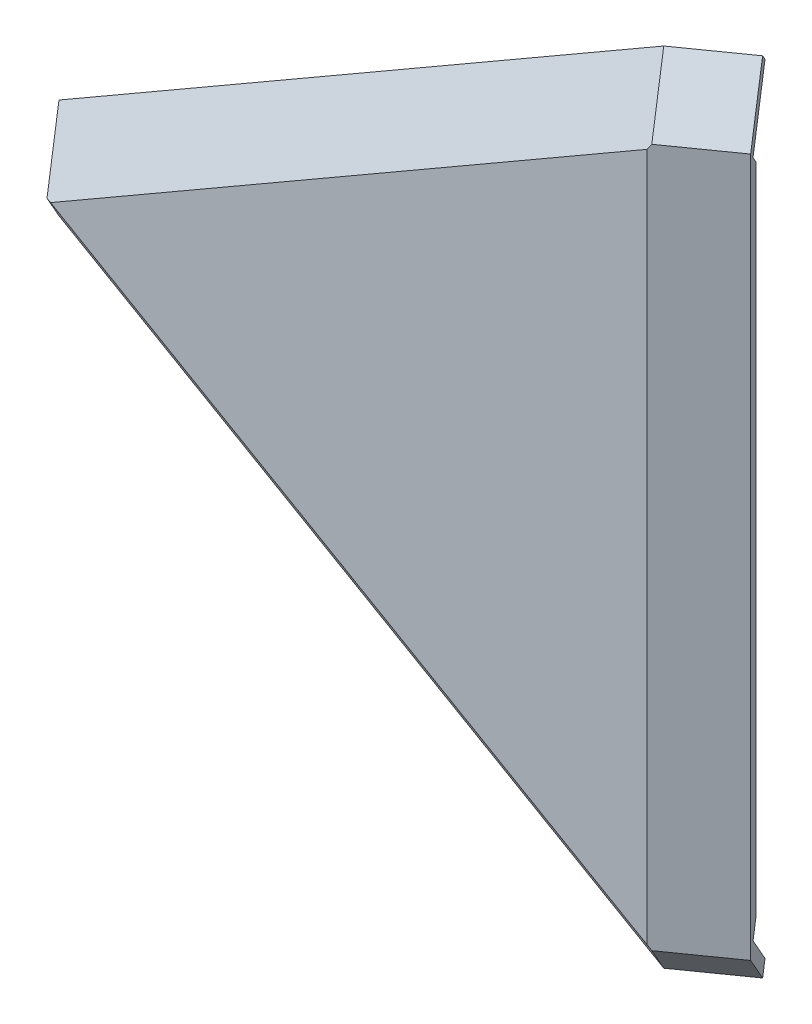
ISO-10303-21;
HEADER;
FILE_DESCRIPTION(('STEP AP214'),'2;1');
FILE_NAME('part.step','',(''),(''),'','','');
FILE_SCHEMA(('AUTOMOTIVE_DESIGN { 1 0 10303 214 1 1 1 1 }'));
ENDSEC;
DATA;
#1=APPLICATION_CONTEXT('core data for automotive mechanical design processes');
#2=APPLICATION_PROTOCOL_DEFINITION('international standard','automotive_design',2000,#1);
#3=PRODUCT_CONTEXT('',#1,'mechanical');
#4=PRODUCT('Part','Part','',(#3));
#5=PRODUCT_RELATED_PRODUCT_CATEGORY('part','',(#4));
#6=PRODUCT_DEFINITION_FORMATION('','',#4);
#7=PRODUCT_DEFINITION_CONTEXT('part definition',#1,'design');
#8=PRODUCT_DEFINITION('design','',#6,#7);
#9=PRODUCT_DEFINITION_SHAPE('','',#8);
#10=(LENGTH_UNIT() NAMED_UNIT(*) SI_UNIT(.MILLI.,.METRE.));
#11=(NAMED_UNIT(*) PLANE_ANGLE_UNIT() SI_UNIT($,.RADIAN.));
#12=(NAMED_UNIT(*) SI_UNIT($,.STERADIAN.) SOLID_ANGLE_UNIT());
#13=UNCERTAINTY_MEASURE_WITH_UNIT(LENGTH_MEASURE(1.E-05),#10,'distance_accuracy_value','');
#14=(GEOMETRIC_REPRESENTATION_CONTEXT(3) GLOBAL_UNCERTAINTY_ASSIGNED_CONTEXT((#13)) GLOBAL_UNIT_ASSIGNED_CONTEXT((#10,
#11,#12)) REPRESENTATION_CONTEXT('',''));
#15=CARTESIAN_POINT('',(0.,0.,0.));
#16=DIRECTION('',(0.,0.,1.));
#17=DIRECTION('',(1.,0.,0.));
#18=AXIS2_PLACEMENT_3D('',#15,#16,#17);
#19=CARTESIAN_POINT('',(107.819353421747,-2.5399538499415E-12,-76.2397959477388));
#20=DIRECTION('',(-0.816496580927468,0.,0.577350269189991));
#21=DIRECTION('',(0.577350269189991,0.,0.816496580927468));
#22=AXIS2_PLACEMENT_3D('',#19,#20,#21);
#23=PLANE('',#22);
#24=DIRECTION('',(0.408248290463936,-0.70710678118654,0.577350269189582));
#25=VECTOR('',#24,1.);
#26=CARTESIAN_POINT('',(153.663121969183,215.235385949433,-11.4069167177377));
#27=LINE('',#26,#25);
#28=CARTESIAN_POINT('',(153.663121969183,215.235385949433,-11.4069167177377));
#29=VERTEX_POINT('',#28);
#30=CARTESIAN_POINT('',(161.82808777846,201.093250325706,0.140088666051075));
#31=VERTEX_POINT('',#30);
#32=EDGE_CURVE('E137',#29,#31,#27,.T.);
#33=ORIENTED_EDGE('',*,*,#32,.T.);
#34=DIRECTION('',(0.408248290464021,0.707106781186744,0.577350269189274));
#35=VECTOR('',#34,1.);
#36=CARTESIAN_POINT('',(161.729030132728,200.921677450416,0.));
#37=LINE('',#36,#35);
#38=CARTESIAN_POINT('',(159.687788680409,197.386143544483,-2.88675134594536));
#39=VERTEX_POINT('',#38);
#40=EDGE_CURVE('E129',#39,#31,#37,.T.);
#41=ORIENTED_EDGE('',*,*,#40,.F.);
#42=DIRECTION('',(-0.408248290463866,0.707106781186549,-0.577350269189621));
#43=VECTOR('',#42,1.);
#44=CARTESIAN_POINT('',(151.522822871132,211.528279168213,-14.4337567297364));
#45=LINE('',#44,#43);
#46=CARTESIAN_POINT('',(151.522822871132,211.528279168213,-14.4337567297364));
#47=VERTEX_POINT('',#46);
#48=EDGE_CURVE('E132',#39,#47,#45,.T.);
#49=ORIENTED_EDGE('',*,*,#48,.T.);
#50=DIRECTION('',(-0.408248290464048,-0.707106781186266,-0.577350269189839));
#51=VECTOR('',#50,1.);
#52=CARTESIAN_POINT('',(153.564064323453,215.063813074144,-11.5470053837871));
#53=LINE('',#52,#51);
#54=EDGE_CURVE('E54',#29,#47,#53,.T.);
#55=ORIENTED_EDGE('',*,*,#54,.F.);
#56=EDGE_LOOP('',(#33,#41,#49,#55));
#57=FACE_BOUND('',#56,.T.);
#58=ADVANCED_FACE('F50',(#57),#23,.F.);
#59=CARTESIAN_POINT('',(178.058961751277,200.921677450415,-11.5470053837999));
#60=DIRECTION('',(0.408248290464223,-0.707106781186351,0.577350269189611));
#61=DIRECTION('',(0.,-0.632455532033772,-0.774596669241405));
#62=AXIS2_PLACEMENT_3D('',#59,#60,#61);
#63=PLANE('',#62);
#64=DIRECTION('',(0.816496580927581,0.,-0.57735026918983));
#65=VECTOR('',#64,1.);
#66=CARTESIAN_POINT('',(161.82808777846,201.093250325706,0.140088666051075));
#67=LINE('',#66,#65);
#68=CARTESIAN_POINT('',(178.158019397012,201.093250325707,-11.4069167177463));
#69=VERTEX_POINT('',#68);
#70=EDGE_CURVE('E713',#31,#69,#67,.T.);
#71=ORIENTED_EDGE('',*,*,#70,.T.);
#72=DIRECTION('',(0.408248290464021,0.707106781186744,0.577350269189274));
#73=VECTOR('',#72,1.);
#74=CARTESIAN_POINT('',(178.058961751277,200.921677450415,-11.5470053837999));
#75=LINE('',#74,#73);
#76=CARTESIAN_POINT('',(176.017720298958,197.386143544483,-14.4337567297453));
#77=VERTEX_POINT('',#76);
#78=EDGE_CURVE('E186',#77,#69,#75,.T.);
#79=ORIENTED_EDGE('',*,*,#78,.F.);
#80=DIRECTION('',(-0.816496580927468,0.,0.577350269189991));
#81=VECTOR('',#80,1.);
#82=CARTESIAN_POINT('',(176.017720298958,197.386143544483,-14.4337567297453));
#83=LINE('',#82,#81);
#84=EDGE_CURVE('E178',#77,#39,#83,.T.);
#85=ORIENTED_EDGE('',*,*,#84,.T.);
#86=ORIENTED_EDGE('',*,*,#40,.T.);
#87=EDGE_LOOP('',(#71,#79,#85,#86));
#88=FACE_BOUND('',#87,.T.);
#89=ADVANCED_FACE('F185',(#88),#63,.F.);
#90=CARTESIAN_POINT('',(29.8424114238205,51.6885728064443,42.203542969526));
#91=DIRECTION('',(0.408248290463677,0.707106781186408,0.577350269189928));
#92=DIRECTION('',(0.,-0.632455532033949,0.77459666924126));
#93=AXIS2_PLACEMENT_3D('',#90,#91,#92);
#94=PLANE('',#93);
#95=DIRECTION('',(-0.816496580927562,1.63757896132236E-13,0.577350269189858));
#96=VECTOR('',#95,1.);
#97=CARTESIAN_POINT('',(178.158019397001,9.83127365477043,-11.4069167177568));
#98=LINE('',#97,#96);
#99=CARTESIAN_POINT('',(178.158019397001,9.83127365477043,-11.4069167177568));
#100=VERTEX_POINT('',#99);
#101=CARTESIAN_POINT('',(161.828087778452,9.8312736547737,0.140088666038639));
#102=VERTEX_POINT('',#101);
#103=EDGE_CURVE('E493',#100,#102,#98,.T.);
#104=ORIENTED_EDGE('',*,*,#103,.T.);
#105=DIRECTION('',(0.408248290464025,-0.707106781186689,0.577350269189339));
#106=VECTOR('',#105,1.);
#107=CARTESIAN_POINT('',(161.729030132728,10.0028465300461,0.));
#108=LINE('',#107,#106);
#109=CARTESIAN_POINT('',(159.687788680408,13.538380435978,-2.88675134594544));
#110=VERTEX_POINT('',#109);
#111=EDGE_CURVE('E77',#110,#102,#108,.T.);
#112=ORIENTED_EDGE('',*,*,#111,.F.);
#113=DIRECTION('',(-0.816496580927468,0.,0.577350269189991));
#114=VECTOR('',#113,1.);
#115=CARTESIAN_POINT('',(176.017720298955,13.5383804359777,-14.4337567297433));
#116=LINE('',#115,#114);
#117=CARTESIAN_POINT('',(176.017720298955,13.5383804359777,-14.4337567297433));
#118=VERTEX_POINT('',#117);
#119=EDGE_CURVE('E180',#118,#110,#116,.T.);
#120=ORIENTED_EDGE('',*,*,#119,.F.);
#121=DIRECTION('',(-0.408248290464035,0.707106781186687,-0.577350269189334));
#122=VECTOR('',#121,1.);
#123=CARTESIAN_POINT('',(176.017720298955,13.5383804359777,-14.4337567297433));
#124=LINE('',#123,#122);
#125=EDGE_CURVE('E462',#100,#118,#124,.T.);
#126=ORIENTED_EDGE('',*,*,#125,.F.);
#127=EDGE_LOOP('',(#104,#112,#120,#126));
#128=FACE_BOUND('',#127,.T.);
#129=ADVANCED_FACE('F247',(#128),#94,.F.);
#130=CARTESIAN_POINT('',(153.564064323454,-4.13928909368204,-11.5470053837986));
#131=DIRECTION('',(-0.816496580927738,-4.41400388462299E-13,0.577350269189609));
#132=DIRECTION('',(0.577350269189609,0.,0.816496580927738));
#133=AXIS2_PLACEMENT_3D('',#130,#131,#132);
#134=PLANE('',#133);
#135=DIRECTION('',(-0.40824829046363,-0.707106781186473,-0.577350269189882));
#136=VECTOR('',#135,1.);
#137=CARTESIAN_POINT('',(161.828087778452,9.8312736547737,0.140088666038639));
#138=LINE('',#137,#136);
#139=CARTESIAN_POINT('',(153.663121969179,-4.31086196895558,-11.4069167177589));
#140=VERTEX_POINT('',#139);
#141=EDGE_CURVE('E497',#102,#140,#138,.T.);
#142=ORIENTED_EDGE('',*,*,#141,.T.);
#143=DIRECTION('',(0.408248290464025,-0.707106781186689,0.577350269189339));
#144=VECTOR('',#143,1.);
#145=CARTESIAN_POINT('',(153.564064323454,-4.13928909368204,-11.5470053837986));
#146=LINE('',#145,#144);
#147=CARTESIAN_POINT('',(151.522822871135,-0.603755187750129,-14.433756729744));
#148=VERTEX_POINT('',#147);
#149=EDGE_CURVE('E379',#148,#140,#146,.T.);
#150=ORIENTED_EDGE('',*,*,#149,.F.);
#151=DIRECTION('',(0.408248290463677,0.707106781186408,0.577350269189928));
#152=VECTOR('',#151,1.);
#153=CARTESIAN_POINT('',(151.522822871135,-0.603755187750129,-14.433756729744));
#154=LINE('',#153,#152);
#155=EDGE_CURVE('E142',#148,#110,#154,.T.);
#156=ORIENTED_EDGE('',*,*,#155,.T.);
#157=ORIENTED_EDGE('',*,*,#111,.T.);
#158=EDGE_LOOP('',(#142,#150,#156,#157));
#159=FACE_BOUND('',#158,.T.);
#160=ADVANCED_FACE('F255',(#159),#134,.F.);
#161=DIRECTION('',(0.816496580927866,2.1926904736363E-13,-0.577350269189428));
#162=VECTOR('',#161,1.);
#163=CARTESIAN_POINT('',(0.470955399494717,105.462261990218,-2.88675134595601));
#164=LINE('',#163,#162);
#165=CARTESIAN_POINT('',(-3.80964279655875,105.462261990225,0.140088666006006));
#166=VERTEX_POINT('',#165);
#167=CARTESIAN_POINT('',(0.470955399494717,105.462261990218,-2.88675134595601));
#168=VERTEX_POINT('',#167);
#169=EDGE_CURVE('E222',#166,#168,#164,.T.);
#170=ORIENTED_EDGE('',*,*,#169,.F.);
#171=DIRECTION('',(-0.408248290463558,0.707106781187085,-0.577350269189184));
#172=VECTOR('',#171,1.);
#173=CARTESIAN_POINT('',(-11.974608605828,119.604397613964,-11.406916717775));
#174=LINE('',#173,#172);
#175=CARTESIAN_POINT('',(-11.974608605828,119.604397613964,-11.406916717775));
#176=VERTEX_POINT('',#175);
#177=EDGE_CURVE('E512',#166,#176,#174,.T.);
#178=ORIENTED_EDGE('',*,*,#177,.T.);
#179=DIRECTION('',(0.816496580927807,-1.24900090270331E-13,-0.577350269189511));
#180=VECTOR('',#179,1.);
#181=CARTESIAN_POINT('',(-11.7764933144139,119.604397613963,-11.5470053837904));
#182=LINE('',#181,#180);
#183=CARTESIAN_POINT('',(-7.69401040977487,119.604397613962,-14.4337567297379));
#184=VERTEX_POINT('',#183);
#185=EDGE_CURVE('E214',#176,#184,#182,.T.);
#186=ORIENTED_EDGE('',*,*,#185,.T.);
#187=DIRECTION('',(0.408248290463855,-0.707106781186555,0.577350269189622));
#188=VECTOR('',#187,1.);
#189=CARTESIAN_POINT('',(0.470955399502234,105.462261990231,-2.8867513459455));
#190=LINE('',#189,#188);
#191=EDGE_CURVE('E205',#184,#168,#190,.T.);
#192=ORIENTED_EDGE('',*,*,#191,.T.);
#193=EDGE_LOOP('',(#170,#178,#186,#192));
#194=FACE_BOUND('',#193,.T.);
#195=ADVANCED_FACE('F237',(#194),#94,.F.);
#196=CARTESIAN_POINT('',(0.,0.,-2.88675134594544));
#197=DIRECTION('',(0.,0.,-1.));
#198=DIRECTION('',(-1.,0.,0.));
#199=AXIS2_PLACEMENT_3D('',#196,#197,#198);
#200=PLANE('',#199);
#201=DIRECTION('',(-0.866025403784436,-0.500000000000004,0.));
#202=VECTOR('',#201,1.);
#203=CARTESIAN_POINT('',(0.470955399502207,105.462261990231,-2.88675134594544));
#204=LINE('',#203,#202);
#205=EDGE_CURVE('E147',#39,#168,#204,.T.);
#206=ORIENTED_EDGE('',*,*,#205,.F.);
#207=DIRECTION('',(0.,1.,0.));
#208=VECTOR('',#207,1.);
#209=CARTESIAN_POINT('',(159.687788680409,197.386143544483,-2.88675134594544));
#210=LINE('',#209,#208);
#211=EDGE_CURVE('E151',#110,#39,#210,.T.);
#212=ORIENTED_EDGE('',*,*,#211,.F.);
#213=DIRECTION('',(0.866025403784434,-0.500000000000009,0.));
#214=VECTOR('',#213,1.);
#215=CARTESIAN_POINT('',(159.687788680408,13.538380435978,-2.88675134594544));
#216=LINE('',#215,#214);
#217=EDGE_CURVE('E156',#168,#110,#216,.T.);
#218=ORIENTED_EDGE('',*,*,#217,.F.);
#219=EDGE_LOOP('',(#206,#212,#218));
#220=FACE_BOUND('',#219,.T.);
#221=ADVANCED_FACE('F149',(#220),#200,.T.);
#222=CARTESIAN_POINT('',(0.,0.,3.));
#223=DIRECTION('',(0.,0.,-1.));
#224=DIRECTION('',(-1.,0.,0.));
#225=AXIS2_PLACEMENT_3D('',#222,#223,#224);
#226=PLANE('',#225);
#227=DIRECTION('',(-0.866025403784435,-0.500000000000006,0.));
#228=VECTOR('',#227,1.);
#229=CARTESIAN_POINT('',(-47.0461367561351,81.4862991614583,3.));
#230=LINE('',#229,#228);
#231=CARTESIAN_POINT('',(162.682541868316,202.573208222072,3.));
#232=VERTEX_POINT('',#231);
#233=CARTESIAN_POINT('',(-5.51855097631453,105.462261990233,3.));
#234=VERTEX_POINT('',#233);
#235=EDGE_CURVE('E171',#232,#234,#230,.T.);
#236=ORIENTED_EDGE('',*,*,#235,.T.);
#237=DIRECTION('',(0.866025403784433,-0.500000000000009,0.));
#238=VECTOR('',#237,1.);
#239=CARTESIAN_POINT('',(44.2868612679779,76.7070938238901,3.));
#240=LINE('',#239,#238);
#241=CARTESIAN_POINT('',(162.682541868316,8.35131575839451,3.));
#242=VERTEX_POINT('',#241);
#243=EDGE_CURVE('E163',#234,#242,#240,.T.);
#244=ORIENTED_EDGE('',*,*,#243,.T.);
#245=DIRECTION('',(0.,1.,0.));
#246=VECTOR('',#245,1.);
#247=CARTESIAN_POINT('',(162.682541868316,-2.90853924134329E-13,3.));
#248=LINE('',#247,#246);
#249=EDGE_CURVE('E360',#242,#232,#248,.T.);
#250=ORIENTED_EDGE('',*,*,#249,.T.);
#251=EDGE_LOOP('',(#236,#244,#250));
#252=FACE_BOUND('',#251,.T.);
#253=ADVANCED_FACE('F263',(#252),#226,.F.);
#254=CARTESIAN_POINT('',(-14.5025062366206,25.119077638911,41.0192820164584));
#255=DIRECTION('',(0.288675134594814,-0.499999999999995,-0.816496580927729));
#256=DIRECTION('',(0.,0.852802865422445,-0.522232967867088));
#257=AXIS2_PLACEMENT_3D('',#254,#255,#256);
#258=PLANE('',#257);
#259=ORIENTED_EDGE('',*,*,#205,.T.);
#260=ORIENTED_EDGE('',*,*,#191,.F.);
#261=DIRECTION('',(-0.866025403784441,-0.499999999999995,0.));
#262=VECTOR('',#261,1.);
#263=CARTESIAN_POINT('',(-7.69401040977487,119.604397613962,-14.4337567297379));
#264=LINE('',#263,#262);
#265=EDGE_CURVE('E169',#47,#184,#264,.T.);
#266=ORIENTED_EDGE('',*,*,#265,.F.);
#267=ORIENTED_EDGE('',*,*,#48,.F.);
#268=EDGE_LOOP('',(#259,#260,#266,#267));
#269=FACE_BOUND('',#268,.T.);
#270=ADVANCED_FACE('F168',(#269),#258,.T.);
#271=CARTESIAN_POINT('',(-16.3891523665647,28.3868445918773,46.3555231051897));
#272=DIRECTION('',(0.288675134594815,-0.499999999999995,-0.816496580927729));
#273=DIRECTION('',(0.,0.852802865422445,-0.522232967867089));
#274=AXIS2_PLACEMENT_3D('',#271,#272,#273);
#275=PLANE('',#274);
#276=ORIENTED_EDGE('',*,*,#235,.F.);
#277=DIRECTION('',(0.47140452079078,0.816496580927816,-0.33333333333347));
#278=VECTOR('',#277,1.);
#279=CARTESIAN_POINT('',(49.0318062200292,5.72435976153241,83.3632058638193));
#280=LINE('',#279,#278);
#281=CARTESIAN_POINT('',(163.461080940316,203.921677450452,2.44948974280926));
#282=VERTEX_POINT('',#281);
#283=EDGE_CURVE('E13',#232,#282,#280,.T.);
#284=ORIENTED_EDGE('',*,*,#283,.T.);
#285=DIRECTION('',(-0.408248290464231,0.707106781186338,-0.577350269189622));
#286=VECTOR('',#285,1.);
#287=CARTESIAN_POINT('',(194.507334865846,150.147988266754,46.355523105131));
#288=LINE('',#287,#286);
#289=CARTESIAN_POINT('',(155.296115131039,218.063813074179,-9.09751564097952));
#290=VERTEX_POINT('',#289);
#291=EDGE_CURVE('E386',#282,#290,#288,.T.);
#292=ORIENTED_EDGE('',*,*,#291,.T.);
#293=DIRECTION('',(-0.866025403784606,-0.499999999999709,-2.42284983216453E-13));
#294=VECTOR('',#293,1.);
#295=CARTESIAN_POINT('',(-55.6003721013752,96.3026693993961,-9.09751564101898));
#296=LINE('',#295,#294);
#297=CARTESIAN_POINT('',(-15.2405949295391,119.604397613963,-9.09751564101679));
#298=VERTEX_POINT('',#297);
#299=EDGE_CURVE('E383',#290,#298,#296,.T.);
#300=ORIENTED_EDGE('',*,*,#299,.T.);
#301=DIRECTION('',(0.408248290463627,-0.707106781186687,0.577350269189622));
#302=VECTOR('',#301,1.);
#303=CARTESIAN_POINT('',(23.970624805246,51.6885728064436,46.3555231051973));
#304=LINE('',#303,#302);
#305=CARTESIAN_POINT('',(-7.07562912026987,105.462261990225,2.4494897427642));
#306=VERTEX_POINT('',#305);
#307=EDGE_CURVE('E371',#298,#306,#304,.T.);
#308=ORIENTED_EDGE('',*,*,#307,.T.);
#309=DIRECTION('',(-0.942809041582021,2.17903721745327E-13,-0.333333333333453));
#310=VECTOR('',#309,1.);
#311=CARTESIAN_POINT('',(-15.6528491225571,105.462261990236,-0.583015470888635));
#312=LINE('',#311,#310);
#313=EDGE_CURVE('E60',#234,#306,#312,.T.);
#314=ORIENTED_EDGE('',*,*,#313,.F.);
#315=EDGE_LOOP('',(#276,#284,#292,#300,#308,#314));
#316=FACE_BOUND('',#315,.T.);
#317=ADVANCED_FACE('F52',(#316),#275,.F.);
#318=CARTESIAN_POINT('',(-39.2112197348178,67.9158248075314,-55.4530387462021));
#319=DIRECTION('',(0.408248290463547,-0.707106781186829,0.577350269189505));
#320=DIRECTION('',(0.,-0.632455532033445,-0.774596669241672));
#321=AXIS2_PLACEMENT_3D('',#318,#319,#320);
#322=PLANE('',#321);
#323=ORIENTED_EDGE('',*,*,#299,.F.);
#324=DIRECTION('',(-0.816496580927639,0.,0.577350269189749));
#325=VECTOR('',#324,1.);
#326=CARTESIAN_POINT('',(171.626046749607,218.063813074178,-20.6445210247855));
#327=LINE('',#326,#325);
#328=CARTESIAN_POINT('',(171.626046749607,218.063813074178,-20.6445210247855));
#329=VERTEX_POINT('',#328);
#330=EDGE_CURVE('E395',#329,#290,#327,.T.);
#331=ORIENTED_EDGE('',*,*,#330,.F.);
#332=DIRECTION('',(0.408248290463962,0.707106781186556,0.577350269189546));
#333=VECTOR('',#332,1.);
#334=CARTESIAN_POINT('',(169.993053587751,215.235385949432,-22.9539221015437));
#335=LINE('',#334,#333);
#336=CARTESIAN_POINT('',(169.993053587751,215.235385949432,-22.9539221015437));
#337=VERTEX_POINT('',#336);
#338=EDGE_CURVE('E510',#337,#329,#335,.T.);
#339=ORIENTED_EDGE('',*,*,#338,.F.);
#340=DIRECTION('',(-0.816496580927639,0.,0.577350269189749));
#341=VECTOR('',#340,1.);
#342=CARTESIAN_POINT('',(169.993053587751,215.235385949432,-22.9539221015437));
#343=LINE('',#342,#341);
#344=EDGE_CURVE('E523',#337,#29,#343,.T.);
#345=ORIENTED_EDGE('',*,*,#344,.T.);
#346=ORIENTED_EDGE('',*,*,#54,.T.);
#347=ORIENTED_EDGE('',*,*,#265,.T.);
#348=ORIENTED_EDGE('',*,*,#185,.F.);
#349=DIRECTION('',(-0.408248290463645,-0.70710678118673,-0.577350269189557));
#350=VECTOR('',#349,1.);
#351=CARTESIAN_POINT('',(-20.1395744151097,105.462261990214,-22.9539221015786));
#352=LINE('',#351,#350);
#353=CARTESIAN_POINT('',(-20.1395744151097,105.462261990214,-22.9539221015786));
#354=VERTEX_POINT('',#353);
#355=EDGE_CURVE('E514',#176,#354,#352,.T.);
#356=ORIENTED_EDGE('',*,*,#355,.T.);
#357=DIRECTION('',(-0.81649658092778,-1.02362562870439E-13,0.577350269189549));
#358=VECTOR('',#357,1.);
#359=CARTESIAN_POINT('',(-20.1395744151097,105.462261990214,-22.9539221015786));
#360=LINE('',#359,#358);
#361=CARTESIAN_POINT('',(-23.4055607388209,105.462261990213,-20.6445210248204));
#362=VERTEX_POINT('',#361);
#363=EDGE_CURVE('E402',#354,#362,#360,.T.);
#364=ORIENTED_EDGE('',*,*,#363,.T.);
#365=DIRECTION('',(-0.408248290463645,-0.70710678118673,-0.577350269189557));
#366=VECTOR('',#365,1.);
#367=CARTESIAN_POINT('',(-23.4055607388209,105.462261990213,-20.6445210248204));
#368=LINE('',#367,#366);
#369=EDGE_CURVE('E398',#298,#362,#368,.T.);
#370=ORIENTED_EDGE('',*,*,#369,.F.);
#371=EDGE_LOOP('',(#323,#331,#339,#345,#346,#347,#348,#356,#364,#370));
#372=FACE_BOUND('',#371,.T.);
#373=ADVANCED_FACE('F231',(#372),#322,.F.);
#374=CARTESIAN_POINT('',(179.791012558844,10.0028465300458,-9.09751564101553));
#375=DIRECTION('',(-0.577350269189991,0.,-0.816496580927468));
#376=DIRECTION('',(-0.816496580927468,0.,0.577350269189991));
#377=AXIS2_PLACEMENT_3D('',#374,#375,#376);
#378=PLANE('',#377);
#379=ORIENTED_EDGE('',*,*,#249,.F.);
#380=DIRECTION('',(0.471404520790943,-0.816496580927673,-0.333333333333588));
#381=VECTOR('',#380,1.);
#382=CARTESIAN_POINT('',(167.749690941435,-0.425243885774727,-0.583015470889195));
#383=LINE('',#382,#381);
#384=CARTESIAN_POINT('',(163.461080940307,7.00284653002721,2.4494897427967));
#385=VERTEX_POINT('',#384);
#386=EDGE_CURVE('E366',#242,#385,#383,.T.);
#387=ORIENTED_EDGE('',*,*,#386,.T.);
#388=DIRECTION('',(-0.816496580927468,-9.08875775284897E-13,0.577350269189991));
#389=VECTOR('',#388,1.);
#390=CARTESIAN_POINT('',(55.6417275185422,7.00284652992497,78.689285690527));
#391=LINE('',#390,#389);
#392=CARTESIAN_POINT('',(179.791012558856,7.00284653002393,-9.0975156409987));
#393=VERTEX_POINT('',#392);
#394=EDGE_CURVE('E188',#393,#385,#391,.T.);
#395=ORIENTED_EDGE('',*,*,#394,.F.);
#396=DIRECTION('',(0.,-1.,0.));
#397=VECTOR('',#396,1.);
#398=CARTESIAN_POINT('',(179.791012558844,-3.02113222563973E-12,-9.09751564101539));
#399=LINE('',#398,#397);
#400=CARTESIAN_POINT('',(179.791012558847,203.921677450417,-9.09751564101752));
#401=VERTEX_POINT('',#400);
#402=EDGE_CURVE('E141',#401,#393,#399,.T.);
#403=ORIENTED_EDGE('',*,*,#402,.F.);
#404=DIRECTION('',(-0.816496580927468,0.,0.577350269189991));
#405=VECTOR('',#404,1.);
#406=CARTESIAN_POINT('',(179.791012558847,203.921677450417,-9.09751564101752));
#407=LINE('',#406,#405);
#408=EDGE_CURVE('E104',#401,#282,#407,.T.);
#409=ORIENTED_EDGE('',*,*,#408,.T.);
#410=ORIENTED_EDGE('',*,*,#283,.F.);
#411=EDGE_LOOP('',(#379,#387,#395,#403,#409,#410));
#412=FACE_BOUND('',#411,.T.);
#413=ADVANCED_FACE('F264',(#412),#378,.F.);
#414=CARTESIAN_POINT('',(176.017720298958,197.386143544483,-14.4337567297453));
#415=DIRECTION('',(0.577350269189991,0.,0.816496580927468));
#416=DIRECTION('',(0.816496580927468,0.,-0.577350269189991));
#417=AXIS2_PLACEMENT_3D('',#414,#415,#416);
#418=PLANE('',#417);
#419=ORIENTED_EDGE('',*,*,#211,.T.);
#420=ORIENTED_EDGE('',*,*,#84,.F.);
#421=DIRECTION('',(0.,1.,0.));
#422=VECTOR('',#421,1.);
#423=CARTESIAN_POINT('',(176.017720298958,197.386143544483,-14.4337567297453));
#424=LINE('',#423,#422);
#425=EDGE_CURVE('E115',#118,#77,#424,.T.);
#426=ORIENTED_EDGE('',*,*,#425,.F.);
#427=ORIENTED_EDGE('',*,*,#119,.T.);
#428=EDGE_LOOP('',(#419,#420,#426,#427));
#429=FACE_BOUND('',#428,.T.);
#430=ADVANCED_FACE('F177',(#429),#418,.F.);
#431=CARTESIAN_POINT('',(124.149285040296,-2.92165249899836E-12,-87.7868013315389));
#432=DIRECTION('',(-0.816496580927466,0.,0.577350269189994));
#433=DIRECTION('',(0.577350269189994,0.,0.816496580927466));
#434=AXIS2_PLACEMENT_3D('',#431,#432,#433);
#435=PLANE('',#434);
#436=ORIENTED_EDGE('',*,*,#402,.T.);
#437=DIRECTION('',(0.408248290463695,0.707106781186473,0.577350269189836));
#438=VECTOR('',#437,1.);
#439=CARTESIAN_POINT('',(171.626046749584,-7.13928909370185,-20.6445210247924));
#440=LINE('',#439,#438);
#441=CARTESIAN_POINT('',(171.626046749584,-7.13928909370185,-20.6445210247924));
#442=VERTEX_POINT('',#441);
#443=EDGE_CURVE('E499',#442,#393,#440,.T.);
#444=ORIENTED_EDGE('',*,*,#443,.F.);
#445=DIRECTION('',(0.40824829046389,-0.707106781186623,0.577350269189515));
#446=VECTOR('',#445,1.);
#447=CARTESIAN_POINT('',(169.993053587729,-4.31086196895535,-22.9539221015505));
#448=LINE('',#447,#446);
#449=CARTESIAN_POINT('',(169.993053587729,-4.31086196895535,-22.9539221015505));
#450=VERTEX_POINT('',#449);
#451=EDGE_CURVE('E409',#450,#442,#448,.T.);
#452=ORIENTED_EDGE('',*,*,#451,.F.);
#453=DIRECTION('',(0.408248290463695,0.707106781186473,0.577350269189836));
#454=VECTOR('',#453,1.);
#455=CARTESIAN_POINT('',(169.993053587729,-4.31086196895535,-22.9539221015505));
#456=LINE('',#455,#454);
#457=EDGE_CURVE('E495',#450,#100,#456,.T.);
#458=ORIENTED_EDGE('',*,*,#457,.T.);
#459=ORIENTED_EDGE('',*,*,#125,.T.);
#460=ORIENTED_EDGE('',*,*,#425,.T.);
#461=ORIENTED_EDGE('',*,*,#78,.T.);
#462=DIRECTION('',(-0.408248290463212,0.70710678118654,-0.577350269190096));
#463=VECTOR('',#462,1.);
#464=CARTESIAN_POINT('',(178.158019397012,201.093250325707,-11.4069167177463));
#465=LINE('',#464,#463);
#466=EDGE_CURVE('E471',#69,#337,#465,.T.);
#467=ORIENTED_EDGE('',*,*,#466,.T.);
#468=ORIENTED_EDGE('',*,*,#338,.T.);
#469=DIRECTION('',(-0.408248290463212,0.70710678118654,-0.577350269190096));
#470=VECTOR('',#469,1.);
#471=CARTESIAN_POINT('',(179.791012558868,203.921677450453,-9.09751564098812));
#472=LINE('',#471,#470);
#473=EDGE_CURVE('E519',#401,#329,#472,.T.);
#474=ORIENTED_EDGE('',*,*,#473,.F.);
#475=EDGE_LOOP('',(#436,#444,#452,#458,#459,#460,#461,#467,#468,#474));
#476=FACE_BOUND('',#475,.T.);
#477=ADVANCED_FACE('F323',(#476),#435,.F.);
#478=CARTESIAN_POINT('',(151.522822871135,-0.603755187750129,-14.433756729744));
#479=DIRECTION('',(-0.288675134594969,-0.500000000000259,0.816496580927512));
#480=DIRECTION('',(0.,-0.85280286542226,-0.52223296786739));
#481=AXIS2_PLACEMENT_3D('',#478,#479,#480);
#482=PLANE('',#481);
#483=ORIENTED_EDGE('',*,*,#217,.T.);
#484=ORIENTED_EDGE('',*,*,#155,.F.);
#485=DIRECTION('',(0.866025403784474,-0.499999999999938,0.));
#486=VECTOR('',#485,1.);
#487=CARTESIAN_POINT('',(151.522822871135,-0.603755187750129,-14.433756729744));
#488=LINE('',#487,#486);
#489=CARTESIAN_POINT('',(-7.69401040977882,91.32012636649,-14.4337567297546));
#490=VERTEX_POINT('',#489);
#491=EDGE_CURVE('E225',#490,#148,#488,.T.);
#492=ORIENTED_EDGE('',*,*,#491,.F.);
#493=DIRECTION('',(0.408248290463677,0.707106781186408,0.577350269189928));
#494=VECTOR('',#493,1.);
#495=CARTESIAN_POINT('',(-7.69401040977882,91.32012636649,-14.4337567297546));
#496=LINE('',#495,#494);
#497=EDGE_CURVE('E219',#490,#168,#496,.T.);
#498=ORIENTED_EDGE('',*,*,#497,.T.);
#499=EDGE_LOOP('',(#483,#484,#492,#498));
#500=FACE_BOUND('',#499,.T.);
#501=ADVANCED_FACE('F312',(#500),#482,.F.);
#502=CARTESIAN_POINT('',(-12.6425187182001,89.8201263664881,-9.09751564102702));
#503=DIRECTION('',(0.288675134594969,0.500000000000259,-0.816496580927512));
#504=DIRECTION('',(0.,0.85280286542226,0.52223296786739));
#505=AXIS2_PLACEMENT_3D('',#502,#503,#504);
#506=PLANE('',#505);
#507=ORIENTED_EDGE('',*,*,#243,.F.);
#508=ORIENTED_EDGE('',*,*,#313,.T.);
#509=DIRECTION('',(0.408248290463677,0.707106781186408,0.577350269189928));
#510=VECTOR('',#509,1.);
#511=CARTESIAN_POINT('',(-15.2405949295535,91.320126366488,-9.09751564102719));
#512=LINE('',#511,#510);
#513=CARTESIAN_POINT('',(-15.2405949295465,91.320126366488,-9.09751564103218));
#514=VERTEX_POINT('',#513);
#515=EDGE_CURVE('E374',#514,#306,#512,.T.);
#516=ORIENTED_EDGE('',*,*,#515,.F.);
#517=DIRECTION('',(-0.866025403784474,0.499999999999938,0.));
#518=VECTOR('',#517,1.);
#519=CARTESIAN_POINT('',(35.7326259227016,61.8907235859811,-9.0975156410238));
#520=LINE('',#519,#518);
#521=CARTESIAN_POINT('',(155.296115131024,-7.13928909368356,-9.09751564101586));
#522=VERTEX_POINT('',#521);
#523=EDGE_CURVE('E375',#522,#514,#520,.T.);
#524=ORIENTED_EDGE('',*,*,#523,.F.);
#525=DIRECTION('',(0.408248290463677,0.707106781186408,0.577350269189928));
#526=VECTOR('',#525,1.);
#527=CARTESIAN_POINT('',(155.296115131024,-7.13928909368358,-9.09751564101586));
#528=LINE('',#527,#526);
#529=EDGE_CURVE('E301',#522,#385,#528,.T.);
#530=ORIENTED_EDGE('',*,*,#529,.T.);
#531=ORIENTED_EDGE('',*,*,#386,.F.);
#532=EDGE_LOOP('',(#507,#508,#516,#524,#530,#531));
#533=FACE_BOUND('',#532,.T.);
#534=ADVANCED_FACE('F322',(#533),#506,.F.);
#535=CARTESIAN_POINT('',(-7.69401040977882,91.32012636649,-14.4337567297546));
#536=DIRECTION('',(0.408248290463769,-0.707106781186687,0.577350269189521));
#537=DIRECTION('',(0.,-0.632455532033532,-0.774596669241601));
#538=AXIS2_PLACEMENT_3D('',#535,#536,#537);
#539=PLANE('',#538);
#540=DIRECTION('',(0.816496580927866,2.1926904736363E-13,-0.577350269189428));
#541=VECTOR('',#540,1.);
#542=CARTESIAN_POINT('',(-7.69401040977882,91.32012636649,-14.4337567297546));
#543=LINE('',#542,#541);
#544=CARTESIAN_POINT('',(-11.9746086058344,91.3201263664889,-11.4069167177903));
#545=VERTEX_POINT('',#544);
#546=EDGE_CURVE('E378',#545,#490,#543,.T.);
#547=ORIENTED_EDGE('',*,*,#546,.F.);
#548=DIRECTION('',(0.408248290463703,0.707106781186628,0.57735026918964));
#549=VECTOR('',#548,1.);
#550=CARTESIAN_POINT('',(-3.80964279655875,105.462261990225,0.140088666006006));
#551=LINE('',#550,#549);
#552=EDGE_CURVE('E68',#545,#166,#551,.T.);
#553=ORIENTED_EDGE('',*,*,#552,.T.);
#554=ORIENTED_EDGE('',*,*,#169,.T.);
#555=ORIENTED_EDGE('',*,*,#497,.F.);
#556=EDGE_LOOP('',(#547,#553,#554,#555));
#557=FACE_BOUND('',#556,.T.);
#558=ADVANCED_FACE('F456',(#557),#539,.F.);
#559=CARTESIAN_POINT('',(21.677445614547,37.5464371827162,30.6565375857275));
#560=DIRECTION('',(0.408248290463677,0.707106781186408,0.577350269189928));
#561=DIRECTION('',(0.,-0.632455532033949,0.77459666924126));
#562=AXIS2_PLACEMENT_3D('',#559,#560,#561);
#563=PLANE('',#562);
#564=ORIENTED_EDGE('',*,*,#491,.T.);
#565=ORIENTED_EDGE('',*,*,#149,.T.);
#566=DIRECTION('',(0.816496580927663,0.,-0.577350269189715));
#567=VECTOR('',#566,1.);
#568=CARTESIAN_POINT('',(153.663121969179,-4.31086196895558,-11.4069167177589));
#569=LINE('',#568,#567);
#570=EDGE_CURVE('E501',#140,#450,#569,.T.);
#571=ORIENTED_EDGE('',*,*,#570,.T.);
#572=ORIENTED_EDGE('',*,*,#451,.T.);
#573=DIRECTION('',(0.816496580927663,0.,-0.577350269189715));
#574=VECTOR('',#573,1.);
#575=CARTESIAN_POINT('',(155.296115131035,-7.13928909370207,-9.0975156410008));
#576=LINE('',#575,#574);
#577=EDGE_CURVE('E507',#522,#442,#576,.T.);
#578=ORIENTED_EDGE('',*,*,#577,.F.);
#579=ORIENTED_EDGE('',*,*,#523,.T.);
#580=DIRECTION('',(0.408248290463873,-0.707106781186538,0.57735026918963));
#581=VECTOR('',#580,1.);
#582=CARTESIAN_POINT('',(-15.2405949295465,91.320126366488,-9.09751564103218));
#583=LINE('',#582,#581);
#584=EDGE_CURVE('E408',#362,#514,#583,.T.);
#585=ORIENTED_EDGE('',*,*,#584,.F.);
#586=ORIENTED_EDGE('',*,*,#363,.F.);
#587=DIRECTION('',(0.408248290463873,-0.707106781186538,0.57735026918963));
#588=VECTOR('',#587,1.);
#589=CARTESIAN_POINT('',(-11.9746086058353,91.3201263664884,-11.4069167177904));
#590=LINE('',#589,#588);
#591=EDGE_CURVE('E453',#354,#545,#590,.T.);
#592=ORIENTED_EDGE('',*,*,#591,.T.);
#593=ORIENTED_EDGE('',*,*,#546,.T.);
#594=EDGE_LOOP('',(#564,#565,#571,#572,#578,#579,#585,#586,#592,#593));
#595=FACE_BOUND('',#594,.T.);
#596=ADVANCED_FACE('F450',(#595),#563,.F.);
#597=CARTESIAN_POINT('',(-2.60580029483083,-3.27282841351587E-13,1.84257905889242));
#598=DIRECTION('',(0.81649658092778,1.02445829597286E-13,-0.577350269189549));
#599=DIRECTION('',(-0.577350269189549,0.,-0.81649658092778));
#600=AXIS2_PLACEMENT_3D('',#597,#598,#599);
#601=PLANE('',#600);
#602=ORIENTED_EDGE('',*,*,#177,.F.);
#603=ORIENTED_EDGE('',*,*,#552,.F.);
#604=ORIENTED_EDGE('',*,*,#591,.F.);
#605=ORIENTED_EDGE('',*,*,#355,.F.);
#606=EDGE_LOOP('',(#602,#603,#604,#605));
#607=FACE_BOUND('',#606,.T.);
#608=ADVANCED_FACE('F583',(#607),#601,.T.);
#609=CARTESIAN_POINT('',(-5.87178661854195,-7.36733092833344E-13,4.15198013565061));
#610=DIRECTION('',(0.81649658092778,1.02445829597286E-13,-0.577350269189549));
#611=DIRECTION('',(-0.577350269189549,0.,-0.81649658092778));
#612=AXIS2_PLACEMENT_3D('',#609,#610,#611);
#613=PLANE('',#612);
#614=ORIENTED_EDGE('',*,*,#307,.F.);
#615=ORIENTED_EDGE('',*,*,#369,.T.);
#616=ORIENTED_EDGE('',*,*,#584,.T.);
#617=ORIENTED_EDGE('',*,*,#515,.T.);
#618=EDGE_LOOP('',(#614,#615,#616,#617));
#619=FACE_BOUND('',#618,.T.);
#620=ADVANCED_FACE('F411',(#619),#613,.F.);
#621=CARTESIAN_POINT('',(24.1663229327892,-41.8572991517095,34.1763416442297));
#622=DIRECTION('',(0.40824829046389,-0.707106781186623,0.577350269189515));
#623=DIRECTION('',(0.,-0.632455532033563,-0.774596669241576));
#624=AXIS2_PLACEMENT_3D('',#621,#622,#623);
#625=PLANE('',#624);
#626=ORIENTED_EDGE('',*,*,#103,.F.);
#627=ORIENTED_EDGE('',*,*,#457,.F.);
#628=ORIENTED_EDGE('',*,*,#570,.F.);
#629=ORIENTED_EDGE('',*,*,#141,.F.);
#630=EDGE_LOOP('',(#626,#627,#628,#629));
#631=FACE_BOUND('',#630,.T.);
#632=ADVANCED_FACE('F494',(#631),#625,.F.);
#633=CARTESIAN_POINT('',(25.7993160946448,-44.685726276456,36.4857427209877));
#634=DIRECTION('',(0.40824829046389,-0.707106781186623,0.577350269189515));
#635=DIRECTION('',(0.,-0.632455532033563,-0.774596669241576));
#636=AXIS2_PLACEMENT_3D('',#633,#634,#635);
#637=PLANE('',#636);
#638=ORIENTED_EDGE('',*,*,#394,.T.);
#639=ORIENTED_EDGE('',*,*,#529,.F.);
#640=ORIENTED_EDGE('',*,*,#577,.T.);
#641=ORIENTED_EDGE('',*,*,#443,.T.);
#642=EDGE_LOOP('',(#638,#639,#640,#641));
#643=FACE_BOUND('',#642,.T.);
#644=ADVANCED_FACE('F518',(#643),#637,.T.);
#645=CARTESIAN_POINT('',(85.05498828223,147.319561141963,120.285917976169));
#646=DIRECTION('',(0.408248290463963,0.707106781186555,0.577350269189547));
#647=DIRECTION('',(0.,-0.63245553203362,0.774596669241529));
#648=AXIS2_PLACEMENT_3D('',#645,#646,#647);
#649=PLANE('',#648);
#650=ORIENTED_EDGE('',*,*,#32,.F.);
#651=ORIENTED_EDGE('',*,*,#344,.F.);
#652=ORIENTED_EDGE('',*,*,#466,.F.);
#653=ORIENTED_EDGE('',*,*,#70,.F.);
#654=EDGE_LOOP('',(#650,#651,#652,#653));
#655=FACE_BOUND('',#654,.T.);
#656=ADVANCED_FACE('F608',(#655),#649,.F.);
#657=CARTESIAN_POINT('',(86.6879814440859,150.14798826671,122.595319052927));
#658=DIRECTION('',(0.408248290463963,0.707106781186555,0.577350269189547));
#659=DIRECTION('',(0.,-0.63245553203362,0.774596669241529));
#660=AXIS2_PLACEMENT_3D('',#657,#658,#659);
#661=PLANE('',#660);
#662=ORIENTED_EDGE('',*,*,#291,.F.);
#663=ORIENTED_EDGE('',*,*,#408,.F.);
#664=ORIENTED_EDGE('',*,*,#473,.T.);
#665=ORIENTED_EDGE('',*,*,#330,.T.);
#666=EDGE_LOOP('',(#662,#663,#664,#665));
#667=FACE_BOUND('',#666,.T.);
#668=ADVANCED_FACE('F616',(#667),#661,.T.);
#669=CLOSED_SHELL('',(#58,#89,#129,#160,#195,#221,#253,#270,#317,#373,#413,#430,#477,#501,#534,
#558,#596,#608,#620,#632,#644,#656,#668));
#670=MANIFOLD_SOLID_BREP('B2',#669);
#671=ADVANCED_BREP_SHAPE_REPRESENTATION('',(#18,#670),#14);
#672=SHAPE_DEFINITION_REPRESENTATION(#9,#671);
ENDSEC;
END-ISO-10303-21;
